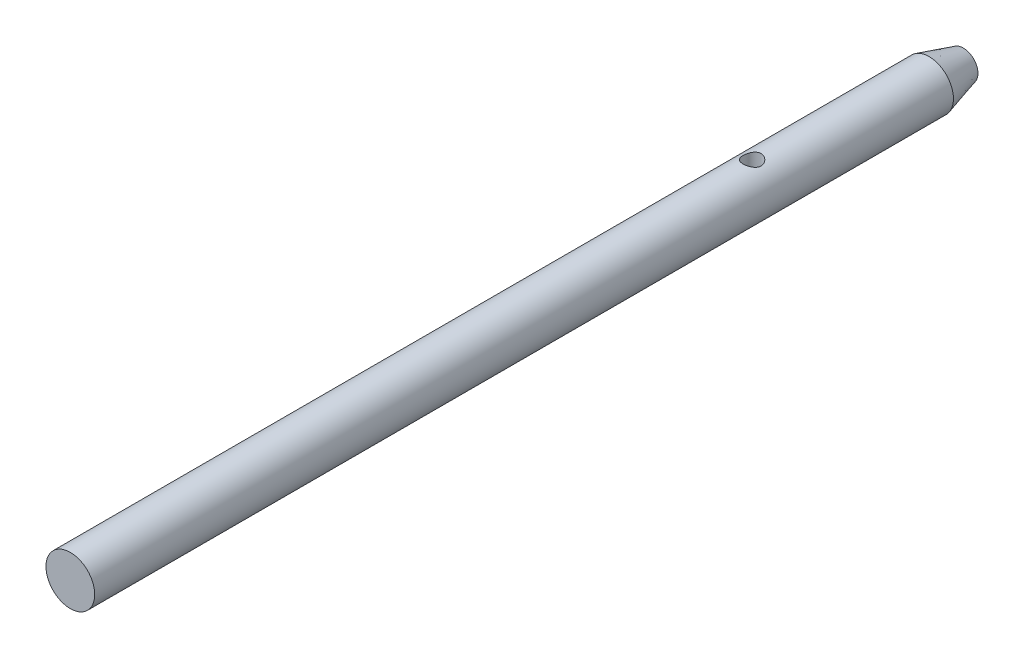
ISO-10303-21;
HEADER;
FILE_DESCRIPTION(('STEP AP214'),'2;1');
FILE_NAME('part.step','',(''),(''),'','','');
FILE_SCHEMA(('AUTOMOTIVE_DESIGN { 1 0 10303 214 1 1 1 1 }'));
ENDSEC;
DATA;
#1=APPLICATION_CONTEXT('core data for automotive mechanical design processes');
#2=APPLICATION_PROTOCOL_DEFINITION('international standard','automotive_design',2000,#1);
#3=PRODUCT_CONTEXT('',#1,'mechanical');
#4=PRODUCT('Part','Part','',(#3));
#5=PRODUCT_RELATED_PRODUCT_CATEGORY('part','',(#4));
#6=PRODUCT_DEFINITION_FORMATION('','',#4);
#7=PRODUCT_DEFINITION_CONTEXT('part definition',#1,'design');
#8=PRODUCT_DEFINITION('design','',#6,#7);
#9=PRODUCT_DEFINITION_SHAPE('','',#8);
#10=(LENGTH_UNIT() NAMED_UNIT(*) SI_UNIT(.MILLI.,.METRE.));
#11=(NAMED_UNIT(*) PLANE_ANGLE_UNIT() SI_UNIT($,.RADIAN.));
#12=(NAMED_UNIT(*) SI_UNIT($,.STERADIAN.) SOLID_ANGLE_UNIT());
#13=UNCERTAINTY_MEASURE_WITH_UNIT(LENGTH_MEASURE(1.E-05),#10,'distance_accuracy_value','');
#14=(GEOMETRIC_REPRESENTATION_CONTEXT(3) GLOBAL_UNCERTAINTY_ASSIGNED_CONTEXT((#13)) GLOBAL_UNIT_ASSIGNED_CONTEXT((#10,
#11,#12)) REPRESENTATION_CONTEXT('',''));
#15=CARTESIAN_POINT('',(0.,0.,0.));
#16=DIRECTION('',(0.,0.,1.));
#17=DIRECTION('',(1.,0.,0.));
#18=AXIS2_PLACEMENT_3D('',#15,#16,#17);
#19=CARTESIAN_POINT('',(0.,0.,78.2));
#20=DIRECTION('',(0.,0.,-1.));
#21=DIRECTION('',(-1.,0.,0.));
#22=AXIS2_PLACEMENT_3D('',#19,#20,#21);
#23=CYLINDRICAL_SURFACE('',#22,2.135);
#24=CARTESIAN_POINT('',(0.,-2.135,19.29));
#25=CARTESIAN_POINT('',(-0.0428238272525146,-2.1350009940098,19.2900013401032));
#26=CARTESIAN_POINT('',(-0.085638357309757,-2.1337002612511,19.2865070010426));
#27=CARTESIAN_POINT('',(-0.169990093325728,-2.12864112528912,19.2726767903511));
#28=CARTESIAN_POINT('',(-0.211527445228046,-2.12488300399346,19.2623417034779));
#29=CARTESIAN_POINT('',(-0.292096286958867,-2.11531311575473,19.2352440665917));
#30=CARTESIAN_POINT('',(-0.331132368726044,-2.10950524735474,19.2184937130613));
#31=CARTESIAN_POINT('',(-0.405838231838684,-2.09641609464971,19.179102199385));
#32=CARTESIAN_POINT('',(-0.441507132774192,-2.08913442654936,19.1564595043622));
#33=CARTESIAN_POINT('',(-0.509946974480535,-2.07351338662565,19.1049435094094));
#34=CARTESIAN_POINT('',(-0.542559501226242,-2.06514462926806,19.0758687440301));
#35=CARTESIAN_POINT('',(-0.602572539428274,-2.04843928389962,19.0127416591513));
#36=CARTESIAN_POINT('',(-0.629971516065413,-2.04010270606756,18.9786878790791));
#37=CARTESIAN_POINT('',(-0.679773875960378,-2.02406609291131,18.9050369260246));
#38=CARTESIAN_POINT('',(-0.701955732021397,-2.01640087631867,18.8652816203101));
#39=CARTESIAN_POINT('',(-0.739248245154464,-2.00303081190102,18.7822761745771));
#40=CARTESIAN_POINT('',(-0.754361641878282,-1.99732520478256,18.7390273962224));
#41=CARTESIAN_POINT('',(-0.77646666746385,-1.98883394910982,18.6520839605847));
#42=CARTESIAN_POINT('',(-0.783760003468851,-1.9859402684505,18.6084769127366));
#43=CARTESIAN_POINT('',(-0.790961267136431,-1.98308390868599,18.5205692854069));
#44=CARTESIAN_POINT('',(-0.790872142551026,-1.98312005972448,18.4762689897974));
#45=CARTESIAN_POINT('',(-0.783542156409132,-1.98602593820376,18.3909682173418));
#46=CARTESIAN_POINT('',(-0.776716560523546,-1.98873113118037,18.3499254196212));
#47=CARTESIAN_POINT('',(-0.756792752812186,-1.99639737240981,18.2696154024085));
#48=CARTESIAN_POINT('',(-0.743693621648512,-2.00135875128379,18.2303484440751));
#49=CARTESIAN_POINT('',(-0.71136124656501,-2.01307961097668,18.1538464392683));
#50=CARTESIAN_POINT('',(-0.692018430804901,-2.01987082265867,18.1166627767925));
#51=CARTESIAN_POINT('',(-0.647824079050184,-2.03447524644867,18.0459472008045));
#52=CARTESIAN_POINT('',(-0.622970676916933,-2.04228880440199,18.0124165301142));
#53=CARTESIAN_POINT('',(-0.566549083268955,-2.05868010145001,17.9476555665624));
#54=CARTESIAN_POINT('',(-0.534648400066002,-2.0672744243697,17.9167184528563));
#55=CARTESIAN_POINT('',(-0.466011737558566,-2.08381932168957,17.8605471978208));
#56=CARTESIAN_POINT('',(-0.429275055022359,-2.09176980219265,17.8353138873685));
#57=CARTESIAN_POINT('',(-0.351277286357768,-2.1062819256944,17.7909545383481));
#58=CARTESIAN_POINT('',(-0.309957626515841,-2.11282143315577,17.7719237361247));
#59=CARTESIAN_POINT('',(-0.22440127916676,-2.1236110947878,17.7411799790662));
#60=CARTESIAN_POINT('',(-0.180165860824172,-2.12786223774206,17.7294638632647));
#61=CARTESIAN_POINT('',(-0.0925029531778528,-2.1334236160906,17.7142401162244));
#62=CARTESIAN_POINT('',(-0.0491529536443193,-2.13487521076022,17.7103375278892));
#63=CARTESIAN_POINT('',(0.0376016534118486,-2.13510916486143,17.7097046980336));
#64=CARTESIAN_POINT('',(0.0810062472026761,-2.13389209764641,17.7129729158887));
#65=CARTESIAN_POINT('',(0.164947028448631,-2.12901880141476,17.7262870400513));
#66=CARTESIAN_POINT('',(0.205529853835498,-2.1254550058492,17.7360762592276));
#67=CARTESIAN_POINT('',(0.284450114556467,-2.11633938227223,17.7618186742843));
#68=CARTESIAN_POINT('',(0.322787256965835,-2.11078729557896,17.7777726722399));
#69=CARTESIAN_POINT('',(0.397376361250218,-2.0980445618673,17.8158967025966));
#70=CARTESIAN_POINT('',(0.43353526677633,-2.09081096072883,17.838234005388));
#71=CARTESIAN_POINT('',(0.501711238114375,-2.07550803529028,17.8883006531025));
#72=CARTESIAN_POINT('',(0.533726796945283,-2.06743840882917,17.9160319507536));
#73=CARTESIAN_POINT('',(0.594596845798324,-2.05078801172393,17.97794301208));
#74=CARTESIAN_POINT('',(0.623170812261933,-2.04220410524591,18.0123984525931));
#75=CARTESIAN_POINT('',(0.674184074189231,-2.02593678452183,18.0857865449927));
#76=CARTESIAN_POINT('',(0.696622894927866,-2.01825343998569,18.1247195430125));
#77=CARTESIAN_POINT('',(0.734732194833676,-2.00469605337354,18.2062344042863));
#78=CARTESIAN_POINT('',(0.750380651462302,-1.99882791579257,18.2488276111607));
#79=CARTESIAN_POINT('',(0.774184352563577,-1.98973091686073,18.3363211483014));
#80=CARTESIAN_POINT('',(0.782344066905023,-1.98650048124964,18.3812200854041));
#81=CARTESIAN_POINT('',(0.790544989748982,-1.98325016337511,18.4690199820063));
#82=CARTESIAN_POINT('',(0.791062925351209,-1.98304176816561,18.5118698191028));
#83=CARTESIAN_POINT('',(0.785180987190091,-1.98537795865399,18.5970114384919));
#84=CARTESIAN_POINT('',(0.778781734233246,-1.98792229729845,18.6393032705198));
#85=CARTESIAN_POINT('',(0.759614417893488,-1.99532229831176,18.720889328424));
#86=CARTESIAN_POINT('',(0.747035916789874,-2.00010898038455,18.7602348755795));
#87=CARTESIAN_POINT('',(0.716032262318212,-2.01141585481088,18.8362812631782));
#88=CARTESIAN_POINT('',(0.697605649861772,-2.0179364797127,18.8729814408015));
#89=CARTESIAN_POINT('',(0.654328772892164,-2.03239368747917,18.9447457343013));
#90=CARTESIAN_POINT('',(0.629196981181888,-2.04038582892592,18.9796287557718));
#91=CARTESIAN_POINT('',(0.573663824928454,-2.05668945480902,19.0448349487086));
#92=CARTESIAN_POINT('',(0.54326080829938,-2.06500103872617,19.0751566850142));
#93=CARTESIAN_POINT('',(0.476152929516309,-2.08152744529652,19.1319889157094));
#94=CARTESIAN_POINT('',(0.439202195132158,-2.08971464340947,19.1582183778302));
#95=CARTESIAN_POINT('',(0.361131124585872,-2.10461087772527,19.204083562761));
#96=CARTESIAN_POINT('',(0.320010649510992,-2.11131986465864,19.2237190658025));
#97=CARTESIAN_POINT('',(0.23334390006495,-2.12267357415785,19.2562136303387));
#98=CARTESIAN_POINT('',(0.187697765137357,-2.12724489208271,19.268834198597));
#99=CARTESIAN_POINT('',(0.0946967591149705,-2.13340685821257,19.2857246889787));
#100=CARTESIAN_POINT('',(0.0473426981359786,-2.13499890109995,19.289998518486));
#101=CARTESIAN_POINT('',(0.,-2.135,19.29));
#102=B_SPLINE_CURVE_WITH_KNOTS('',3,(#24,#25,#26,#27,#28,#29,#30,#31,#32,#33,#34,#35,#36,#37,
#38,#39,#40,#41,#42,#43,#44,#45,#46,#47,#48,#49,#50,#51,#52,#53,#54,#55,#56,#57,#58,#59,#60,#61,
#62,#63,#64,#65,#66,#67,#68,#69,#70,#71,#72,#73,#74,#75,#76,#77,#78,#79,#80,#81,#82,#83,#84,#85,
#86,#87,#88,#89,#90,#91,#92,#93,#94,#95,#96,#97,#98,#99,#100,#101),.UNSPECIFIED.,.T.,.F.,(4,2,2,
2,2,2,2,2,2,2,2,2,2,2,2,2,2,2,2,2,2,2,2,2,2,2,2,2,2,2,2,2,2,2,2,2,2,2,4),(0.,0.128296906151909,
0.256579096872609,0.384618602955328,0.512691495075932,0.645557490133345,0.778462539355701,
0.916269570445694,1.0540231447953,1.18624628604036,1.31841663199489,1.44291805088535,
1.56743772007746,1.6942736561903,1.82115261058118,1.95631650778028,2.09150008173078,
2.22867098807368,2.36578257631508,2.49576835788818,2.62572621517235,2.75084900285138,
2.87598807524934,3.00476618121446,3.13359099435013,3.26968911584709,3.4057977653605,
3.54234460250331,3.67880988467715,3.80672312123309,3.93462487873572,4.05882725883751,
4.18306065149938,4.31368056914014,4.44434149939483,4.5818128805035,4.7192888429054,
4.86119038481296,5.00302548198714),.UNSPECIFIED.);
#103=CARTESIAN_POINT('',(0.,-2.135,19.29));
#104=VERTEX_POINT('',#103);
#105=EDGE_CURVE('E51',#104,#104,#102,.T.);
#106=ORIENTED_EDGE('',*,*,#105,.F.);
#107=EDGE_LOOP('',(#106));
#108=FACE_BOUND('',#107,.T.);
#109=CARTESIAN_POINT('',(0.,2.135,17.71));
#110=CARTESIAN_POINT('',(0.04282382725251,2.1350009940098,17.7099986598968));
#111=CARTESIAN_POINT('',(0.0856383573097523,2.1337002612511,17.7134929989574));
#112=CARTESIAN_POINT('',(0.169990093325723,2.12864112528912,17.7273232096489));
#113=CARTESIAN_POINT('',(0.211527445228041,2.12488300399346,17.7376582965221));
#114=CARTESIAN_POINT('',(0.292096286958862,2.11531311575473,17.7647559334083));
#115=CARTESIAN_POINT('',(0.331132368726039,2.10950524735474,17.7815062869387));
#116=CARTESIAN_POINT('',(0.405838231838679,2.09641609464971,17.820897800615));
#117=CARTESIAN_POINT('',(0.441507132774188,2.08913442654937,17.8435404956378));
#118=CARTESIAN_POINT('',(0.509946974480531,2.07351338662565,17.8950564905906));
#119=CARTESIAN_POINT('',(0.542559501226237,2.06514462926806,17.9241312559699));
#120=CARTESIAN_POINT('',(0.602572539428269,2.04843928389962,17.9872583408487));
#121=CARTESIAN_POINT('',(0.629971516065409,2.04010270606756,18.0213121209209));
#122=CARTESIAN_POINT('',(0.679773875960374,2.02406609291131,18.0949630739754));
#123=CARTESIAN_POINT('',(0.701955732021394,2.01640087631867,18.1347183796899));
#124=CARTESIAN_POINT('',(0.739248245154461,2.00303081190102,18.2177238254229));
#125=CARTESIAN_POINT('',(0.754361641878278,1.99732520478256,18.2609726037776));
#126=CARTESIAN_POINT('',(0.776466667463845,1.98883394910982,18.3479160394153));
#127=CARTESIAN_POINT('',(0.783760003468847,1.9859402684505,18.3915230872634));
#128=CARTESIAN_POINT('',(0.790961267136426,1.98308390868599,18.4794307145931));
#129=CARTESIAN_POINT('',(0.790872142551021,1.98312005972448,18.5237310102026));
#130=CARTESIAN_POINT('',(0.783542156409127,1.98602593820376,18.6090317826582));
#131=CARTESIAN_POINT('',(0.776716560523542,1.98873113118037,18.6500745803788));
#132=CARTESIAN_POINT('',(0.756792752812181,1.99639737240981,18.7303845975915));
#133=CARTESIAN_POINT('',(0.743693621648508,2.00135875128379,18.7696515559249));
#134=CARTESIAN_POINT('',(0.711361246565005,2.01307961097669,18.8461535607317));
#135=CARTESIAN_POINT('',(0.692018430804897,2.01987082265867,18.8833372232075));
#136=CARTESIAN_POINT('',(0.647824079050179,2.03447524644867,18.9540527991955));
#137=CARTESIAN_POINT('',(0.622970676916928,2.04228880440199,18.9875834698858));
#138=CARTESIAN_POINT('',(0.566549083268951,2.05868010145001,19.0523444334376));
#139=CARTESIAN_POINT('',(0.534648400066,2.0672744243697,19.0832815471437));
#140=CARTESIAN_POINT('',(0.466011737558565,2.08381932168957,19.1394528021792));
#141=CARTESIAN_POINT('',(0.429275055022358,2.09176980219265,19.1646861126315));
#142=CARTESIAN_POINT('',(0.351277286357766,2.1062819256944,19.2090454616519));
#143=CARTESIAN_POINT('',(0.309957626515838,2.11282143315577,19.2280762638753));
#144=CARTESIAN_POINT('',(0.224401279166757,2.1236110947878,19.2588200209337));
#145=CARTESIAN_POINT('',(0.180165860824168,2.12786223774206,19.2705361367353));
#146=CARTESIAN_POINT('',(0.0925029531778487,2.13342361609059,19.2857598837756));
#147=CARTESIAN_POINT('',(0.0491529536443154,2.13487521076022,19.2896624721108));
#148=CARTESIAN_POINT('',(-0.0376016534118525,2.13510916486143,19.2902953019664));
#149=CARTESIAN_POINT('',(-0.0810062472026801,2.13389209764641,19.2870270841113));
#150=CARTESIAN_POINT('',(-0.164947028448636,2.12901880141476,19.2737129599486));
#151=CARTESIAN_POINT('',(-0.205529853835503,2.1254550058492,19.2639237407724));
#152=CARTESIAN_POINT('',(-0.284450114556471,2.11633938227223,19.2381813257157));
#153=CARTESIAN_POINT('',(-0.322787256965839,2.11078729557896,19.2222273277601));
#154=CARTESIAN_POINT('',(-0.397376361250221,2.0980445618673,19.1841032974034));
#155=CARTESIAN_POINT('',(-0.433535266776332,2.09081096072883,19.161765994612));
#156=CARTESIAN_POINT('',(-0.501711238114377,2.07550803529028,19.1116993468975));
#157=CARTESIAN_POINT('',(-0.533726796945286,2.06743840882917,19.0839680492464));
#158=CARTESIAN_POINT('',(-0.594596845798329,2.05078801172393,19.02205698792));
#159=CARTESIAN_POINT('',(-0.623170812261938,2.0422041052459,18.9876015474069));
#160=CARTESIAN_POINT('',(-0.674184074189236,2.02593678452183,18.9142134550073));
#161=CARTESIAN_POINT('',(-0.696622894927872,2.01825343998569,18.8752804569875));
#162=CARTESIAN_POINT('',(-0.734732194833681,2.00469605337354,18.7937655957137));
#163=CARTESIAN_POINT('',(-0.750380651462307,1.99882791579257,18.7511723888393));
#164=CARTESIAN_POINT('',(-0.774184352563582,1.98973091686073,18.6636788516986));
#165=CARTESIAN_POINT('',(-0.782344066905027,1.98650048124964,18.6187799145959));
#166=CARTESIAN_POINT('',(-0.790544989748987,1.9832501633751,18.5309800179937));
#167=CARTESIAN_POINT('',(-0.791062925351214,1.98304176816561,18.4881301808972));
#168=CARTESIAN_POINT('',(-0.785180987190095,1.98537795865398,18.4029885615081));
#169=CARTESIAN_POINT('',(-0.778781734233251,1.98792229729845,18.3606967294802));
#170=CARTESIAN_POINT('',(-0.759614417893492,1.99532229831176,18.279110671576));
#171=CARTESIAN_POINT('',(-0.747035916789878,2.00010898038454,18.2397651244205));
#172=CARTESIAN_POINT('',(-0.716032262318217,2.01141585481088,18.1637187368218));
#173=CARTESIAN_POINT('',(-0.697605649861776,2.0179364797127,18.1270185591985));
#174=CARTESIAN_POINT('',(-0.654328772892169,2.03239368747917,18.0552542656987));
#175=CARTESIAN_POINT('',(-0.629196981181893,2.04038582892592,18.0203712442282));
#176=CARTESIAN_POINT('',(-0.573663824928459,2.05668945480902,17.9551650512914));
#177=CARTESIAN_POINT('',(-0.543260808299386,2.06500103872616,17.9248433149858));
#178=CARTESIAN_POINT('',(-0.476152929516314,2.08152744529652,17.8680110842906));
#179=CARTESIAN_POINT('',(-0.439202195132161,2.08971464340947,17.8417816221698));
#180=CARTESIAN_POINT('',(-0.361131124585875,2.10461087772527,17.795916437239));
#181=CARTESIAN_POINT('',(-0.320010649510996,2.11131986465864,17.7762809341975));
#182=CARTESIAN_POINT('',(-0.233343900064955,2.12267357415785,17.7437863696613));
#183=CARTESIAN_POINT('',(-0.187697765137363,2.12724489208271,17.731165801403));
#184=CARTESIAN_POINT('',(-0.0946967591149755,2.13340685821257,17.7142753110213));
#185=CARTESIAN_POINT('',(-0.0473426981359833,2.13499890109995,17.710001481514));
#186=CARTESIAN_POINT('',(0.,2.135,17.71));
#187=B_SPLINE_CURVE_WITH_KNOTS('',3,(#109,#110,#111,#112,#113,#114,#115,#116,#117,#118,#119,
#120,#121,#122,#123,#124,#125,#126,#127,#128,#129,#130,#131,#132,#133,#134,#135,#136,#137,#138,
#139,#140,#141,#142,#143,#144,#145,#146,#147,#148,#149,#150,#151,#152,#153,#154,#155,#156,#157,
#158,#159,#160,#161,#162,#163,#164,#165,#166,#167,#168,#169,#170,#171,#172,#173,#174,#175,#176,
#177,#178,#179,#180,#181,#182,#183,#184,#185,#186),.UNSPECIFIED.,.T.,.F.,(4,2,2,2,2,2,2,2,2,2,2,
2,2,2,2,2,2,2,2,2,2,2,2,2,2,2,2,2,2,2,2,2,2,2,2,2,2,2,4),(0.,0.128296906151909,
0.256579096872608,0.384618602955328,0.512691495075932,0.645557490133345,0.7784625393557,
0.916269570445701,1.0540231447953,1.18624628604036,1.31841663199489,1.44291805088535,
1.56743772007746,1.6942736561903,1.82115261058118,1.95631650778027,2.09150008173078,
2.22867098807368,2.36578257631507,2.49576835788818,2.62572621517235,2.75084900285138,
2.87598807524933,3.00476618121446,3.13359099435012,3.26968911584709,3.4057977653605,
3.54234460250331,3.67880988467715,3.80672312123309,3.93462487873572,4.05882725883751,
4.18306065149938,4.31368056914013,4.44434149939483,4.5818128805035,4.7192888429054,
4.86119038481296,5.00302548198714),.UNSPECIFIED.);
#188=CARTESIAN_POINT('',(0.,2.135,17.71));
#189=VERTEX_POINT('',#188);
#190=EDGE_CURVE('E61',#189,#189,#187,.T.);
#191=ORIENTED_EDGE('',*,*,#190,.T.);
#192=EDGE_LOOP('',(#191));
#193=FACE_BOUND('',#192,.T.);
#194=CARTESIAN_POINT('',(0.,0.,3.));
#195=DIRECTION('',(0.,0.,1.));
#196=DIRECTION('',(1.,0.,0.));
#197=AXIS2_PLACEMENT_3D('',#194,#195,#196);
#198=CIRCLE('',#197,2.135);
#199=CARTESIAN_POINT('',(2.135,0.,3.));
#200=VERTEX_POINT('',#199);
#201=EDGE_CURVE('E43',#200,#200,#198,.T.);
#202=ORIENTED_EDGE('',*,*,#201,.T.);
#203=EDGE_LOOP('',(#202));
#204=FACE_BOUND('',#203,.T.);
#205=CARTESIAN_POINT('',(0.,0.,78.2));
#206=DIRECTION('',(0.,0.,1.));
#207=DIRECTION('',(1.,0.,0.));
#208=AXIS2_PLACEMENT_3D('',#205,#206,#207);
#209=CIRCLE('',#208,2.135);
#210=CARTESIAN_POINT('',(2.135,0.,78.2));
#211=VERTEX_POINT('',#210);
#212=EDGE_CURVE('E47',#211,#211,#209,.T.);
#213=ORIENTED_EDGE('',*,*,#212,.F.);
#214=EDGE_LOOP('',(#213));
#215=FACE_BOUND('',#214,.T.);
#216=ADVANCED_FACE('F36',(#108,#193,#204,#215),#23,.T.);
#217=CARTESIAN_POINT('',(0.,0.,78.2));
#218=DIRECTION('',(0.,0.,1.));
#219=DIRECTION('',(1.,0.,0.));
#220=AXIS2_PLACEMENT_3D('',#217,#218,#219);
#221=PLANE('',#220);
#222=ORIENTED_EDGE('',*,*,#212,.T.);
#223=EDGE_LOOP('',(#222));
#224=FACE_BOUND('',#223,.T.);
#225=ADVANCED_FACE('F75',(#224),#221,.T.);
#226=CARTESIAN_POINT('',(0.,0.,0.));
#227=DIRECTION('',(0.,0.,1.));
#228=DIRECTION('',(1.,0.,0.));
#229=AXIS2_PLACEMENT_3D('',#226,#227,#228);
#230=PLANE('',#229);
#231=CARTESIAN_POINT('',(0.,0.,0.));
#232=DIRECTION('',(0.,0.,1.));
#233=DIRECTION('',(1.,0.,0.));
#234=AXIS2_PLACEMENT_3D('',#231,#232,#233);
#235=CIRCLE('',#234,1.28499999999998);
#236=CARTESIAN_POINT('',(1.28499999999998,0.,0.));
#237=VERTEX_POINT('',#236);
#238=EDGE_CURVE('E10',#237,#237,#235,.F.);
#239=ORIENTED_EDGE('',*,*,#238,.T.);
#240=EDGE_LOOP('',(#239));
#241=FACE_BOUND('',#240,.T.);
#242=ADVANCED_FACE('F78',(#241),#230,.F.);
#243=CARTESIAN_POINT('',(0.,0.,3.));
#244=DIRECTION('',(0.,0.,1.));
#245=DIRECTION('',(1.,0.,0.));
#246=AXIS2_PLACEMENT_3D('',#243,#244,#245);
#247=CONICAL_SURFACE('',#246,2.135,0.276097019395443);
#248=ORIENTED_EDGE('',*,*,#238,.F.);
#249=EDGE_LOOP('',(#248));
#250=FACE_BOUND('',#249,.T.);
#251=ORIENTED_EDGE('',*,*,#201,.F.);
#252=EDGE_LOOP('',(#251));
#253=FACE_BOUND('',#252,.T.);
#254=ADVANCED_FACE('F38',(#250,#253),#247,.T.);
#255=CARTESIAN_POINT('',(0.,-2.136,18.5));
#256=DIRECTION('',(0.,1.,0.));
#257=DIRECTION('',(0.,0.,1.));
#258=AXIS2_PLACEMENT_3D('',#255,#256,#257);
#259=CYLINDRICAL_SURFACE('',#258,0.79);
#260=ORIENTED_EDGE('',*,*,#105,.T.);
#261=EDGE_LOOP('',(#260));
#262=FACE_BOUND('',#261,.T.);
#263=ORIENTED_EDGE('',*,*,#190,.F.);
#264=EDGE_LOOP('',(#263));
#265=FACE_BOUND('',#264,.T.);
#266=ADVANCED_FACE('F67',(#262,#265),#259,.F.);
#267=CLOSED_SHELL('',(#216,#225,#242,#254,#266));
#268=MANIFOLD_SOLID_BREP('B2',#267);
#269=ADVANCED_BREP_SHAPE_REPRESENTATION('',(#18,#268),#14);
#270=SHAPE_DEFINITION_REPRESENTATION(#9,#269);
ENDSEC;
END-ISO-10303-21;
